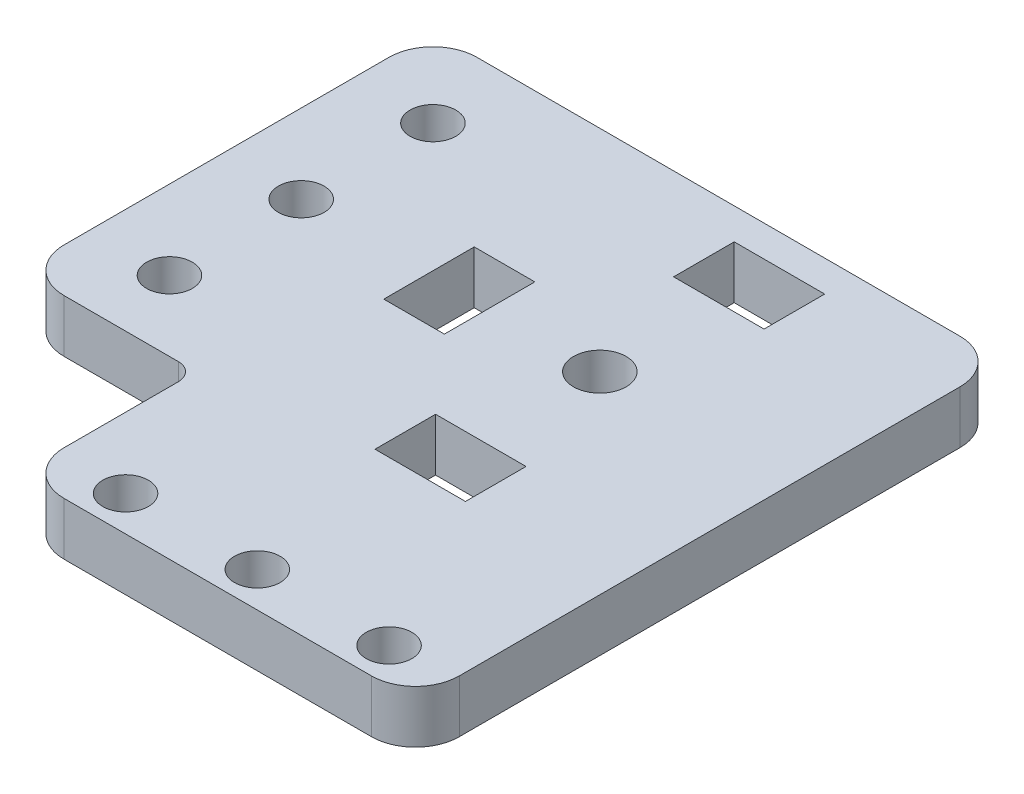
ISO-10303-21;
HEADER;
FILE_DESCRIPTION(('STEP AP214'),'2;1');
FILE_NAME('part.step','',(''),(''),'','','');
FILE_SCHEMA(('AUTOMOTIVE_DESIGN { 1 0 10303 214 1 1 1 1 }'));
ENDSEC;
DATA;
#1=APPLICATION_CONTEXT('core data for automotive mechanical design processes');
#2=APPLICATION_PROTOCOL_DEFINITION('international standard','automotive_design',2000,#1);
#3=PRODUCT_CONTEXT('',#1,'mechanical');
#4=PRODUCT('Part','Part','',(#3));
#5=PRODUCT_RELATED_PRODUCT_CATEGORY('part','',(#4));
#6=PRODUCT_DEFINITION_FORMATION('','',#4);
#7=PRODUCT_DEFINITION_CONTEXT('part definition',#1,'design');
#8=PRODUCT_DEFINITION('design','',#6,#7);
#9=PRODUCT_DEFINITION_SHAPE('','',#8);
#10=(LENGTH_UNIT() NAMED_UNIT(*) SI_UNIT(.MILLI.,.METRE.));
#11=(NAMED_UNIT(*) PLANE_ANGLE_UNIT() SI_UNIT($,.RADIAN.));
#12=(NAMED_UNIT(*) SI_UNIT($,.STERADIAN.) SOLID_ANGLE_UNIT());
#13=UNCERTAINTY_MEASURE_WITH_UNIT(LENGTH_MEASURE(1.E-05),#10,'distance_accuracy_value','');
#14=(GEOMETRIC_REPRESENTATION_CONTEXT(3) GLOBAL_UNCERTAINTY_ASSIGNED_CONTEXT((#13)) GLOBAL_UNIT_ASSIGNED_CONTEXT((#10,
#11,#12)) REPRESENTATION_CONTEXT('',''));
#15=CARTESIAN_POINT('',(0.,0.,0.));
#16=DIRECTION('',(0.,0.,1.));
#17=DIRECTION('',(1.,0.,0.));
#18=AXIS2_PLACEMENT_3D('',#15,#16,#17);
#19=CARTESIAN_POINT('',(20.,-6.,-5.));
#20=DIRECTION('',(-1.,0.,0.));
#21=DIRECTION('',(0.,0.,1.));
#22=AXIS2_PLACEMENT_3D('',#19,#20,#21);
#23=PLANE('',#22);
#24=DIRECTION('',(0.,0.,1.));
#25=VECTOR('',#24,1.);
#26=CARTESIAN_POINT('',(20.,0.,-5.));
#27=LINE('',#26,#25);
#28=CARTESIAN_POINT('',(20.,0.,-23.));
#29=VERTEX_POINT('',#28);
#30=CARTESIAN_POINT('',(20.,0.,-10.));
#31=VERTEX_POINT('',#30);
#32=EDGE_CURVE('E341',#29,#31,#27,.T.);
#33=ORIENTED_EDGE('',*,*,#32,.F.);
#34=DIRECTION('',(0.,1.,0.));
#35=VECTOR('',#34,1.);
#36=CARTESIAN_POINT('',(20.,-6.,-23.));
#37=LINE('',#36,#35);
#38=CARTESIAN_POINT('',(20.,-6.,-23.));
#39=VERTEX_POINT('',#38);
#40=EDGE_CURVE('E426',#29,#39,#37,.F.);
#41=ORIENTED_EDGE('',*,*,#40,.T.);
#42=DIRECTION('',(0.,0.,1.));
#43=VECTOR('',#42,1.);
#44=CARTESIAN_POINT('',(20.,-6.,-5.));
#45=LINE('',#44,#43);
#46=CARTESIAN_POINT('',(20.,-6.,-10.));
#47=VERTEX_POINT('',#46);
#48=EDGE_CURVE('E344',#39,#47,#45,.T.);
#49=ORIENTED_EDGE('',*,*,#48,.T.);
#50=DIRECTION('',(0.,1.,0.));
#51=VECTOR('',#50,1.);
#52=CARTESIAN_POINT('',(20.,-6.,-10.));
#53=LINE('',#52,#51);
#54=EDGE_CURVE('E410',#47,#31,#53,.T.);
#55=ORIENTED_EDGE('',*,*,#54,.T.);
#56=EDGE_LOOP('',(#33,#41,#49,#55));
#57=FACE_BOUND('',#56,.T.);
#58=ADVANCED_FACE('F39',(#57),#23,.T.);
#59=CARTESIAN_POINT('',(20.,-6.,-25.));
#60=DIRECTION('',(0.,0.,1.));
#61=DIRECTION('',(1.,0.,0.));
#62=AXIS2_PLACEMENT_3D('',#59,#60,#61);
#63=PLANE('',#62);
#64=DIRECTION('',(1.,0.,0.));
#65=VECTOR('',#64,1.);
#66=CARTESIAN_POINT('',(20.,-6.,-25.));
#67=LINE('',#66,#65);
#68=CARTESIAN_POINT('',(5.,-6.,-25.));
#69=VERTEX_POINT('',#68);
#70=CARTESIAN_POINT('',(18.,-6.,-25.));
#71=VERTEX_POINT('',#70);
#72=EDGE_CURVE('E359',#69,#71,#67,.T.);
#73=ORIENTED_EDGE('',*,*,#72,.T.);
#74=DIRECTION('',(0.,1.,0.));
#75=VECTOR('',#74,1.);
#76=CARTESIAN_POINT('',(18.,0.,-25.));
#77=LINE('',#76,#75);
#78=CARTESIAN_POINT('',(18.,0.,-25.));
#79=VERTEX_POINT('',#78);
#80=EDGE_CURVE('E423',#71,#79,#77,.T.);
#81=ORIENTED_EDGE('',*,*,#80,.T.);
#82=DIRECTION('',(1.,0.,0.));
#83=VECTOR('',#82,1.);
#84=CARTESIAN_POINT('',(20.,0.,-25.));
#85=LINE('',#84,#83);
#86=CARTESIAN_POINT('',(5.,0.,-25.));
#87=VERTEX_POINT('',#86);
#88=EDGE_CURVE('E347',#87,#79,#85,.T.);
#89=ORIENTED_EDGE('',*,*,#88,.F.);
#90=DIRECTION('',(0.,1.,0.));
#91=VECTOR('',#90,1.);
#92=CARTESIAN_POINT('',(5.,-6.,-25.));
#93=LINE('',#92,#91);
#94=EDGE_CURVE('E408',#87,#69,#93,.F.);
#95=ORIENTED_EDGE('',*,*,#94,.T.);
#96=EDGE_LOOP('',(#73,#81,#89,#95));
#97=FACE_BOUND('',#96,.T.);
#98=ADVANCED_FACE('F444',(#97),#63,.T.);
#99=CARTESIAN_POINT('',(0.,-6.,-25.));
#100=DIRECTION('',(-1.,0.,0.));
#101=DIRECTION('',(0.,0.,1.));
#102=AXIS2_PLACEMENT_3D('',#99,#100,#101);
#103=PLANE('',#102);
#104=DIRECTION('',(0.,0.,1.));
#105=VECTOR('',#104,1.);
#106=CARTESIAN_POINT('',(0.,0.,-25.));
#107=LINE('',#106,#105);
#108=CARTESIAN_POINT('',(0.,0.,-67.));
#109=VERTEX_POINT('',#108);
#110=CARTESIAN_POINT('',(0.,0.,-30.));
#111=VERTEX_POINT('',#110);
#112=EDGE_CURVE('E373',#109,#111,#107,.T.);
#113=ORIENTED_EDGE('',*,*,#112,.F.);
#114=DIRECTION('',(0.,1.,0.));
#115=VECTOR('',#114,1.);
#116=CARTESIAN_POINT('',(0.,-6.,-67.));
#117=LINE('',#116,#115);
#118=CARTESIAN_POINT('',(0.,-6.,-67.));
#119=VERTEX_POINT('',#118);
#120=EDGE_CURVE('E395',#109,#119,#117,.F.);
#121=ORIENTED_EDGE('',*,*,#120,.T.);
#122=DIRECTION('',(0.,0.,1.));
#123=VECTOR('',#122,1.);
#124=CARTESIAN_POINT('',(0.,-6.,-25.));
#125=LINE('',#124,#123);
#126=CARTESIAN_POINT('',(0.,-6.,-30.));
#127=VERTEX_POINT('',#126);
#128=EDGE_CURVE('E356',#119,#127,#125,.T.);
#129=ORIENTED_EDGE('',*,*,#128,.T.);
#130=DIRECTION('',(0.,1.,0.));
#131=VECTOR('',#130,1.);
#132=CARTESIAN_POINT('',(0.,-6.,-30.));
#133=LINE('',#132,#131);
#134=EDGE_CURVE('E392',#127,#111,#133,.T.);
#135=ORIENTED_EDGE('',*,*,#134,.T.);
#136=EDGE_LOOP('',(#113,#121,#129,#135));
#137=FACE_BOUND('',#136,.T.);
#138=ADVANCED_FACE('F452',(#137),#103,.T.);
#139=CARTESIAN_POINT('',(0.,-6.,-72.));
#140=DIRECTION('',(0.,0.,-1.));
#141=DIRECTION('',(-1.,0.,0.));
#142=AXIS2_PLACEMENT_3D('',#139,#140,#141);
#143=PLANE('',#142);
#144=DIRECTION('',(-1.,0.,0.));
#145=VECTOR('',#144,1.);
#146=CARTESIAN_POINT('',(0.,-6.,-72.));
#147=LINE('',#146,#145);
#148=CARTESIAN_POINT('',(60.,-6.,-72.));
#149=VERTEX_POINT('',#148);
#150=CARTESIAN_POINT('',(5.,-6.,-72.));
#151=VERTEX_POINT('',#150);
#152=EDGE_CURVE('E353',#149,#151,#147,.T.);
#153=ORIENTED_EDGE('',*,*,#152,.T.);
#154=DIRECTION('',(0.,1.,0.));
#155=VECTOR('',#154,1.);
#156=CARTESIAN_POINT('',(5.,-6.,-72.));
#157=LINE('',#156,#155);
#158=CARTESIAN_POINT('',(5.,0.,-72.));
#159=VERTEX_POINT('',#158);
#160=EDGE_CURVE('E379',#151,#159,#157,.T.);
#161=ORIENTED_EDGE('',*,*,#160,.T.);
#162=DIRECTION('',(-1.,0.,0.));
#163=VECTOR('',#162,1.);
#164=CARTESIAN_POINT('',(0.,0.,-72.));
#165=LINE('',#164,#163);
#166=CARTESIAN_POINT('',(60.,0.,-72.));
#167=VERTEX_POINT('',#166);
#168=EDGE_CURVE('E370',#167,#159,#165,.T.);
#169=ORIENTED_EDGE('',*,*,#168,.F.);
#170=DIRECTION('',(0.,1.,0.));
#171=VECTOR('',#170,1.);
#172=CARTESIAN_POINT('',(60.,-6.,-72.));
#173=LINE('',#172,#171);
#174=EDGE_CURVE('E362',#167,#149,#173,.F.);
#175=ORIENTED_EDGE('',*,*,#174,.T.);
#176=EDGE_LOOP('',(#153,#161,#169,#175));
#177=FACE_BOUND('',#176,.T.);
#178=ADVANCED_FACE('F460',(#177),#143,.T.);
#179=CARTESIAN_POINT('',(65.,-6.,-72.));
#180=DIRECTION('',(1.,0.,0.));
#181=DIRECTION('',(0.,0.,-1.));
#182=AXIS2_PLACEMENT_3D('',#179,#180,#181);
#183=PLANE('',#182);
#184=DIRECTION('',(0.,0.,-1.));
#185=VECTOR('',#184,1.);
#186=CARTESIAN_POINT('',(65.,-6.,-72.));
#187=LINE('',#186,#185);
#188=CARTESIAN_POINT('',(65.,-6.,-10.));
#189=VERTEX_POINT('',#188);
#190=CARTESIAN_POINT('',(65.,-6.,-67.));
#191=VERTEX_POINT('',#190);
#192=EDGE_CURVE('E350',#189,#191,#187,.T.);
#193=ORIENTED_EDGE('',*,*,#192,.T.);
#194=DIRECTION('',(0.,1.,0.));
#195=VECTOR('',#194,1.);
#196=CARTESIAN_POINT('',(65.,-6.,-67.));
#197=LINE('',#196,#195);
#198=CARTESIAN_POINT('',(65.,0.,-67.));
#199=VERTEX_POINT('',#198);
#200=EDGE_CURVE('E420',#191,#199,#197,.T.);
#201=ORIENTED_EDGE('',*,*,#200,.T.);
#202=DIRECTION('',(0.,0.,-1.));
#203=VECTOR('',#202,1.);
#204=CARTESIAN_POINT('',(65.,0.,-72.));
#205=LINE('',#204,#203);
#206=CARTESIAN_POINT('',(65.,0.,-10.));
#207=VERTEX_POINT('',#206);
#208=EDGE_CURVE('E367',#207,#199,#205,.T.);
#209=ORIENTED_EDGE('',*,*,#208,.F.);
#210=DIRECTION('',(0.,1.,0.));
#211=VECTOR('',#210,1.);
#212=CARTESIAN_POINT('',(65.,-6.,-10.));
#213=LINE('',#212,#211);
#214=EDGE_CURVE('E418',#207,#189,#213,.F.);
#215=ORIENTED_EDGE('',*,*,#214,.T.);
#216=EDGE_LOOP('',(#193,#201,#209,#215));
#217=FACE_BOUND('',#216,.T.);
#218=ADVANCED_FACE('F469',(#217),#183,.T.);
#219=CARTESIAN_POINT('',(65.,-6.,-5.00000000000001));
#220=DIRECTION('',(0.,0.,1.));
#221=DIRECTION('',(1.,0.,0.));
#222=AXIS2_PLACEMENT_3D('',#219,#220,#221);
#223=PLANE('',#222);
#224=DIRECTION('',(1.,0.,0.));
#225=VECTOR('',#224,1.);
#226=CARTESIAN_POINT('',(65.,0.,-5.00000000000001));
#227=LINE('',#226,#225);
#228=CARTESIAN_POINT('',(25.,0.,-5.));
#229=VERTEX_POINT('',#228);
#230=CARTESIAN_POINT('',(60.,0.,-5.00000000000001));
#231=VERTEX_POINT('',#230);
#232=EDGE_CURVE('E364',#229,#231,#227,.T.);
#233=ORIENTED_EDGE('',*,*,#232,.F.);
#234=DIRECTION('',(0.,1.,0.));
#235=VECTOR('',#234,1.);
#236=CARTESIAN_POINT('',(25.,-6.,-5.));
#237=LINE('',#236,#235);
#238=CARTESIAN_POINT('',(25.,-6.,-5.));
#239=VERTEX_POINT('',#238);
#240=EDGE_CURVE('E416',#229,#239,#237,.F.);
#241=ORIENTED_EDGE('',*,*,#240,.T.);
#242=DIRECTION('',(1.,0.,0.));
#243=VECTOR('',#242,1.);
#244=CARTESIAN_POINT('',(65.,-6.,-5.00000000000001));
#245=LINE('',#244,#243);
#246=CARTESIAN_POINT('',(60.,-6.,-5.00000000000001));
#247=VERTEX_POINT('',#246);
#248=EDGE_CURVE('E346',#239,#247,#245,.T.);
#249=ORIENTED_EDGE('',*,*,#248,.T.);
#250=DIRECTION('',(0.,1.,0.));
#251=VECTOR('',#250,1.);
#252=CARTESIAN_POINT('',(60.,-6.,-5.00000000000001));
#253=LINE('',#252,#251);
#254=EDGE_CURVE('E413',#247,#231,#253,.T.);
#255=ORIENTED_EDGE('',*,*,#254,.T.);
#256=EDGE_LOOP('',(#233,#241,#249,#255));
#257=FACE_BOUND('',#256,.T.);
#258=ADVANCED_FACE('F479',(#257),#223,.T.);
#259=CARTESIAN_POINT('',(0.,-6.,0.));
#260=DIRECTION('',(0.,1.,0.));
#261=DIRECTION('',(0.,0.,1.));
#262=AXIS2_PLACEMENT_3D('',#259,#260,#261);
#263=PLANE('',#262);
#264=DIRECTION('',(1.,0.,0.));
#265=VECTOR('',#264,1.);
#266=CARTESIAN_POINT('',(0.,-6.,-42.8500000000001));
#267=LINE('',#266,#265);
#268=CARTESIAN_POINT('',(23.55,-6.,-42.8500000000001));
#269=VERTEX_POINT('',#268);
#270=CARTESIAN_POINT('',(30.45,-6.,-42.85));
#271=VERTEX_POINT('',#270);
#272=EDGE_CURVE('E301',#269,#271,#267,.T.);
#273=ORIENTED_EDGE('',*,*,#272,.T.);
#274=DIRECTION('',(0.,0.,-1.));
#275=VECTOR('',#274,1.);
#276=CARTESIAN_POINT('',(30.45,-6.,0.));
#277=LINE('',#276,#275);
#278=CARTESIAN_POINT('',(30.45,-6.,-53.15));
#279=VERTEX_POINT('',#278);
#280=EDGE_CURVE('E304',#271,#279,#277,.T.);
#281=ORIENTED_EDGE('',*,*,#280,.T.);
#282=DIRECTION('',(-1.,0.,0.));
#283=VECTOR('',#282,1.);
#284=CARTESIAN_POINT('',(0.,-6.,-53.15));
#285=LINE('',#284,#283);
#286=CARTESIAN_POINT('',(23.55,-6.,-53.15));
#287=VERTEX_POINT('',#286);
#288=EDGE_CURVE('E298',#279,#287,#285,.T.);
#289=ORIENTED_EDGE('',*,*,#288,.T.);
#290=DIRECTION('',(0.,0.,1.));
#291=VECTOR('',#290,1.);
#292=CARTESIAN_POINT('',(23.55,-6.,0.));
#293=LINE('',#292,#291);
#294=EDGE_CURVE('E204',#287,#269,#293,.T.);
#295=ORIENTED_EDGE('',*,*,#294,.T.);
#296=EDGE_LOOP('',(#273,#281,#289,#295));
#297=FACE_BOUND('',#296,.T.);
#298=CARTESIAN_POINT('',(43.,-6.,-48.));
#299=DIRECTION('',(0.,1.,0.));
#300=DIRECTION('',(0.,0.,1.));
#301=AXIS2_PLACEMENT_3D('',#298,#299,#300);
#302=CIRCLE('',#301,3.00000000000001);
#303=CARTESIAN_POINT('',(43.,-6.,-45.));
#304=VERTEX_POINT('',#303);
#305=EDGE_CURVE('E295',#304,#304,#302,.T.);
#306=ORIENTED_EDGE('',*,*,#305,.T.);
#307=EDGE_LOOP('',(#306));
#308=FACE_BOUND('',#307,.T.);
#309=DIRECTION('',(1.,0.,0.));
#310=VECTOR('',#309,1.);
#311=CARTESIAN_POINT('',(0.,-6.,-61.5500000000001));
#312=LINE('',#311,#310);
#313=CARTESIAN_POINT('',(37.85,-6.,-61.5500000000001));
#314=VERTEX_POINT('',#313);
#315=CARTESIAN_POINT('',(48.15,-6.,-61.55));
#316=VERTEX_POINT('',#315);
#317=EDGE_CURVE('E289',#314,#316,#312,.T.);
#318=ORIENTED_EDGE('',*,*,#317,.T.);
#319=DIRECTION('',(0.,0.,-1.));
#320=VECTOR('',#319,1.);
#321=CARTESIAN_POINT('',(48.15,-6.,0.));
#322=LINE('',#321,#320);
#323=CARTESIAN_POINT('',(48.15,-6.,-68.45));
#324=VERTEX_POINT('',#323);
#325=EDGE_CURVE('E292',#316,#324,#322,.T.);
#326=ORIENTED_EDGE('',*,*,#325,.T.);
#327=DIRECTION('',(-1.,0.,0.));
#328=VECTOR('',#327,1.);
#329=CARTESIAN_POINT('',(0.,-6.,-68.45));
#330=LINE('',#329,#328);
#331=CARTESIAN_POINT('',(37.85,-6.,-68.45));
#332=VERTEX_POINT('',#331);
#333=EDGE_CURVE('E283',#324,#332,#330,.T.);
#334=ORIENTED_EDGE('',*,*,#333,.T.);
#335=DIRECTION('',(0.,0.,1.));
#336=VECTOR('',#335,1.);
#337=CARTESIAN_POINT('',(37.8499999999999,-6.,0.));
#338=LINE('',#337,#336);
#339=EDGE_CURVE('E286',#332,#314,#338,.T.);
#340=ORIENTED_EDGE('',*,*,#339,.T.);
#341=EDGE_LOOP('',(#318,#326,#334,#340));
#342=FACE_BOUND('',#341,.T.);
#343=DIRECTION('',(1.,0.,0.));
#344=VECTOR('',#343,1.);
#345=CARTESIAN_POINT('',(0.,-6.,-27.55));
#346=LINE('',#345,#344);
#347=CARTESIAN_POINT('',(37.85,-6.,-27.55));
#348=VERTEX_POINT('',#347);
#349=CARTESIAN_POINT('',(48.1499999999999,-6.,-27.55));
#350=VERTEX_POINT('',#349);
#351=EDGE_CURVE('E277',#348,#350,#346,.T.);
#352=ORIENTED_EDGE('',*,*,#351,.T.);
#353=DIRECTION('',(0.,0.,-1.));
#354=VECTOR('',#353,1.);
#355=CARTESIAN_POINT('',(48.1499999999999,-6.,0.));
#356=LINE('',#355,#354);
#357=CARTESIAN_POINT('',(48.15,-6.,-34.45));
#358=VERTEX_POINT('',#357);
#359=EDGE_CURVE('E280',#350,#358,#356,.T.);
#360=ORIENTED_EDGE('',*,*,#359,.T.);
#361=DIRECTION('',(-1.,0.,0.));
#362=VECTOR('',#361,1.);
#363=CARTESIAN_POINT('',(0.,-6.,-34.45));
#364=LINE('',#363,#362);
#365=CARTESIAN_POINT('',(37.85,-6.,-34.45));
#366=VERTEX_POINT('',#365);
#367=EDGE_CURVE('E228',#358,#366,#364,.T.);
#368=ORIENTED_EDGE('',*,*,#367,.T.);
#369=DIRECTION('',(0.,0.,1.));
#370=VECTOR('',#369,1.);
#371=CARTESIAN_POINT('',(37.85,-6.,0.));
#372=LINE('',#371,#370);
#373=EDGE_CURVE('E274',#366,#348,#372,.T.);
#374=ORIENTED_EDGE('',*,*,#373,.T.);
#375=EDGE_LOOP('',(#352,#360,#368,#374));
#376=FACE_BOUND('',#375,.T.);
#377=CARTESIAN_POINT('',(8.99999999999984,-6.,-63.));
#378=DIRECTION('',(0.,1.,0.));
#379=DIRECTION('',(0.,0.,1.));
#380=AXIS2_PLACEMENT_3D('',#377,#378,#379);
#381=CIRCLE('',#380,2.60000000000001);
#382=CARTESIAN_POINT('',(8.99999999999984,-6.,-60.4));
#383=VERTEX_POINT('',#382);
#384=EDGE_CURVE('E308',#383,#383,#381,.T.);
#385=ORIENTED_EDGE('',*,*,#384,.T.);
#386=EDGE_LOOP('',(#385));
#387=FACE_BOUND('',#386,.T.);
#388=CARTESIAN_POINT('',(8.9999999999999,-6.,-48.));
#389=DIRECTION('',(0.,1.,0.));
#390=DIRECTION('',(0.,0.,1.));
#391=AXIS2_PLACEMENT_3D('',#388,#389,#390);
#392=CIRCLE('',#391,2.6);
#393=CARTESIAN_POINT('',(8.9999999999999,-6.,-45.4));
#394=VERTEX_POINT('',#393);
#395=EDGE_CURVE('E314',#394,#394,#392,.T.);
#396=ORIENTED_EDGE('',*,*,#395,.T.);
#397=EDGE_LOOP('',(#396));
#398=FACE_BOUND('',#397,.T.);
#399=CARTESIAN_POINT('',(9.,-6.,-33.));
#400=DIRECTION('',(0.,1.,0.));
#401=DIRECTION('',(0.,0.,1.));
#402=AXIS2_PLACEMENT_3D('',#399,#400,#401);
#403=CIRCLE('',#402,2.6);
#404=CARTESIAN_POINT('',(9.,-6.,-30.4));
#405=VERTEX_POINT('',#404);
#406=EDGE_CURVE('E320',#405,#405,#403,.T.);
#407=ORIENTED_EDGE('',*,*,#406,.T.);
#408=EDGE_LOOP('',(#407));
#409=FACE_BOUND('',#408,.T.);
#410=CARTESIAN_POINT('',(58.,-6.,-8.99999999999999));
#411=DIRECTION('',(0.,1.,0.));
#412=DIRECTION('',(0.,0.,1.));
#413=AXIS2_PLACEMENT_3D('',#410,#411,#412);
#414=CIRCLE('',#413,2.59999999999997);
#415=CARTESIAN_POINT('',(58.,-6.,-6.40000000000003));
#416=VERTEX_POINT('',#415);
#417=EDGE_CURVE('E326',#416,#416,#414,.T.);
#418=ORIENTED_EDGE('',*,*,#417,.T.);
#419=EDGE_LOOP('',(#418));
#420=FACE_BOUND('',#419,.T.);
#421=CARTESIAN_POINT('',(43.,-6.,-8.99999999999999));
#422=DIRECTION('',(0.,1.,0.));
#423=DIRECTION('',(0.,0.,1.));
#424=AXIS2_PLACEMENT_3D('',#421,#422,#423);
#425=CIRCLE('',#424,2.6);
#426=CARTESIAN_POINT('',(43.,-6.,-6.39999999999999));
#427=VERTEX_POINT('',#426);
#428=EDGE_CURVE('E332',#427,#427,#425,.T.);
#429=ORIENTED_EDGE('',*,*,#428,.T.);
#430=EDGE_LOOP('',(#429));
#431=FACE_BOUND('',#430,.T.);
#432=CARTESIAN_POINT('',(28.,-6.,-8.99999999999999));
#433=DIRECTION('',(0.,1.,0.));
#434=DIRECTION('',(0.,0.,1.));
#435=AXIS2_PLACEMENT_3D('',#432,#433,#434);
#436=CIRCLE('',#435,2.6);
#437=CARTESIAN_POINT('',(28.,-6.,-6.39999999999999));
#438=VERTEX_POINT('',#437);
#439=EDGE_CURVE('E338',#438,#438,#436,.T.);
#440=ORIENTED_EDGE('',*,*,#439,.T.);
#441=EDGE_LOOP('',(#440));
#442=FACE_BOUND('',#441,.T.);
#443=ORIENTED_EDGE('',*,*,#128,.F.);
#444=CARTESIAN_POINT('',(5.,-6.,-67.));
#445=DIRECTION('',(0.,1.,0.));
#446=DIRECTION('',(0.,0.,1.));
#447=AXIS2_PLACEMENT_3D('',#444,#445,#446);
#448=CIRCLE('',#447,5.);
#449=EDGE_CURVE('E406',#119,#151,#448,.F.);
#450=ORIENTED_EDGE('',*,*,#449,.T.);
#451=ORIENTED_EDGE('',*,*,#152,.F.);
#452=CARTESIAN_POINT('',(60.,-6.,-67.));
#453=DIRECTION('',(0.,1.,0.));
#454=DIRECTION('',(0.,0.,1.));
#455=AXIS2_PLACEMENT_3D('',#452,#453,#454);
#456=CIRCLE('',#455,5.);
#457=EDGE_CURVE('E399',#149,#191,#456,.F.);
#458=ORIENTED_EDGE('',*,*,#457,.T.);
#459=ORIENTED_EDGE('',*,*,#192,.F.);
#460=CARTESIAN_POINT('',(60.,-6.,-10.));
#461=DIRECTION('',(0.,1.,0.));
#462=DIRECTION('',(0.,0.,1.));
#463=AXIS2_PLACEMENT_3D('',#460,#461,#462);
#464=CIRCLE('',#463,5.);
#465=EDGE_CURVE('E397',#189,#247,#464,.F.);
#466=ORIENTED_EDGE('',*,*,#465,.T.);
#467=ORIENTED_EDGE('',*,*,#248,.F.);
#468=CARTESIAN_POINT('',(25.,-6.,-10.));
#469=DIRECTION('',(0.,1.,0.));
#470=DIRECTION('',(0.,0.,1.));
#471=AXIS2_PLACEMENT_3D('',#468,#469,#470);
#472=CIRCLE('',#471,5.);
#473=EDGE_CURVE('E401',#239,#47,#472,.F.);
#474=ORIENTED_EDGE('',*,*,#473,.T.);
#475=ORIENTED_EDGE('',*,*,#48,.F.);
#476=CARTESIAN_POINT('',(18.,-6.,-23.));
#477=DIRECTION('',(0.,1.,0.));
#478=DIRECTION('',(0.,0.,1.));
#479=AXIS2_PLACEMENT_3D('',#476,#477,#478);
#480=CIRCLE('',#479,2.);
#481=EDGE_CURVE('E11',#39,#71,#480,.T.);
#482=ORIENTED_EDGE('',*,*,#481,.T.);
#483=ORIENTED_EDGE('',*,*,#72,.F.);
#484=CARTESIAN_POINT('',(5.,-6.,-30.));
#485=DIRECTION('',(0.,1.,0.));
#486=DIRECTION('',(0.,0.,1.));
#487=AXIS2_PLACEMENT_3D('',#484,#485,#486);
#488=CIRCLE('',#487,5.);
#489=EDGE_CURVE('E404',#69,#127,#488,.F.);
#490=ORIENTED_EDGE('',*,*,#489,.T.);
#491=EDGE_LOOP('',(#443,#450,#451,#458,#459,#466,#467,#474,#475,#482,#483,#490));
#492=FACE_BOUND('',#491,.T.);
#493=ADVANCED_FACE('F441',(#297,#308,#342,#376,#387,#398,#409,#420,#431,#442,#492),#263,.F.);
#494=CARTESIAN_POINT('',(0.,0.,0.));
#495=DIRECTION('',(0.,1.,0.));
#496=DIRECTION('',(0.,0.,1.));
#497=AXIS2_PLACEMENT_3D('',#494,#495,#496);
#498=PLANE('',#497);
#499=DIRECTION('',(0.,0.,-1.));
#500=VECTOR('',#499,1.);
#501=CARTESIAN_POINT('',(30.45,0.,-42.85));
#502=LINE('',#501,#500);
#503=CARTESIAN_POINT('',(30.45,0.,-42.85));
#504=VERTEX_POINT('',#503);
#505=CARTESIAN_POINT('',(30.45,0.,-53.15));
#506=VERTEX_POINT('',#505);
#507=EDGE_CURVE('E216',#504,#506,#502,.T.);
#508=ORIENTED_EDGE('',*,*,#507,.F.);
#509=DIRECTION('',(1.,0.,0.));
#510=VECTOR('',#509,1.);
#511=CARTESIAN_POINT('',(23.55,0.,-42.8500000000001));
#512=LINE('',#511,#510);
#513=CARTESIAN_POINT('',(23.55,0.,-42.8500000000001));
#514=VERTEX_POINT('',#513);
#515=EDGE_CURVE('E221',#514,#504,#512,.T.);
#516=ORIENTED_EDGE('',*,*,#515,.F.);
#517=DIRECTION('',(0.,0.,1.));
#518=VECTOR('',#517,1.);
#519=CARTESIAN_POINT('',(23.55,0.,-53.15));
#520=LINE('',#519,#518);
#521=CARTESIAN_POINT('',(23.55,0.,-53.15));
#522=VERTEX_POINT('',#521);
#523=EDGE_CURVE('E201',#522,#514,#520,.T.);
#524=ORIENTED_EDGE('',*,*,#523,.F.);
#525=DIRECTION('',(-1.,0.,0.));
#526=VECTOR('',#525,1.);
#527=CARTESIAN_POINT('',(30.45,0.,-53.15));
#528=LINE('',#527,#526);
#529=EDGE_CURVE('E211',#506,#522,#528,.T.);
#530=ORIENTED_EDGE('',*,*,#529,.F.);
#531=EDGE_LOOP('',(#508,#516,#524,#530));
#532=FACE_BOUND('',#531,.T.);
#533=CARTESIAN_POINT('',(43.,0.,-48.));
#534=DIRECTION('',(0.,1.,0.));
#535=DIRECTION('',(0.,0.,1.));
#536=AXIS2_PLACEMENT_3D('',#533,#534,#535);
#537=CIRCLE('',#536,3.00000000000001);
#538=CARTESIAN_POINT('',(43.,0.,-45.));
#539=VERTEX_POINT('',#538);
#540=EDGE_CURVE('E231',#539,#539,#537,.T.);
#541=ORIENTED_EDGE('',*,*,#540,.F.);
#542=EDGE_LOOP('',(#541));
#543=FACE_BOUND('',#542,.T.);
#544=DIRECTION('',(0.,0.,-1.));
#545=VECTOR('',#544,1.);
#546=CARTESIAN_POINT('',(48.15,0.,-61.55));
#547=LINE('',#546,#545);
#548=CARTESIAN_POINT('',(48.15,0.,-61.55));
#549=VERTEX_POINT('',#548);
#550=CARTESIAN_POINT('',(48.15,0.,-68.45));
#551=VERTEX_POINT('',#550);
#552=EDGE_CURVE('E234',#549,#551,#547,.T.);
#553=ORIENTED_EDGE('',*,*,#552,.F.);
#554=DIRECTION('',(1.,0.,0.));
#555=VECTOR('',#554,1.);
#556=CARTESIAN_POINT('',(37.85,0.,-61.5500000000001));
#557=LINE('',#556,#555);
#558=CARTESIAN_POINT('',(37.85,0.,-61.5500000000001));
#559=VERTEX_POINT('',#558);
#560=EDGE_CURVE('E262',#559,#549,#557,.T.);
#561=ORIENTED_EDGE('',*,*,#560,.F.);
#562=DIRECTION('',(0.,0.,1.));
#563=VECTOR('',#562,1.);
#564=CARTESIAN_POINT('',(37.85,0.,-68.45));
#565=LINE('',#564,#563);
#566=CARTESIAN_POINT('',(37.85,0.,-68.45));
#567=VERTEX_POINT('',#566);
#568=EDGE_CURVE('E259',#567,#559,#565,.T.);
#569=ORIENTED_EDGE('',*,*,#568,.F.);
#570=DIRECTION('',(-1.,0.,0.));
#571=VECTOR('',#570,1.);
#572=CARTESIAN_POINT('',(48.15,0.,-68.45));
#573=LINE('',#572,#571);
#574=EDGE_CURVE('E257',#551,#567,#573,.T.);
#575=ORIENTED_EDGE('',*,*,#574,.F.);
#576=EDGE_LOOP('',(#553,#561,#569,#575));
#577=FACE_BOUND('',#576,.T.);
#578=DIRECTION('',(0.,0.,-1.));
#579=VECTOR('',#578,1.);
#580=CARTESIAN_POINT('',(48.1499999999999,0.,-27.55));
#581=LINE('',#580,#579);
#582=CARTESIAN_POINT('',(48.1499999999999,0.,-27.55));
#583=VERTEX_POINT('',#582);
#584=CARTESIAN_POINT('',(48.15,0.,-34.45));
#585=VERTEX_POINT('',#584);
#586=EDGE_CURVE('E235',#583,#585,#581,.T.);
#587=ORIENTED_EDGE('',*,*,#586,.F.);
#588=DIRECTION('',(1.,0.,0.));
#589=VECTOR('',#588,1.);
#590=CARTESIAN_POINT('',(37.85,0.,-27.55));
#591=LINE('',#590,#589);
#592=CARTESIAN_POINT('',(37.85,0.,-27.55));
#593=VERTEX_POINT('',#592);
#594=EDGE_CURVE('E244',#593,#583,#591,.T.);
#595=ORIENTED_EDGE('',*,*,#594,.F.);
#596=DIRECTION('',(0.,0.,1.));
#597=VECTOR('',#596,1.);
#598=CARTESIAN_POINT('',(37.85,0.,-34.45));
#599=LINE('',#598,#597);
#600=CARTESIAN_POINT('',(37.85,0.,-34.45));
#601=VERTEX_POINT('',#600);
#602=EDGE_CURVE('E241',#601,#593,#599,.T.);
#603=ORIENTED_EDGE('',*,*,#602,.F.);
#604=DIRECTION('',(-1.,0.,0.));
#605=VECTOR('',#604,1.);
#606=CARTESIAN_POINT('',(48.15,0.,-34.45));
#607=LINE('',#606,#605);
#608=EDGE_CURVE('E237',#585,#601,#607,.T.);
#609=ORIENTED_EDGE('',*,*,#608,.F.);
#610=EDGE_LOOP('',(#587,#595,#603,#609));
#611=FACE_BOUND('',#610,.T.);
#612=CARTESIAN_POINT('',(8.99999999999984,0.,-63.));
#613=DIRECTION('',(0.,1.,0.));
#614=DIRECTION('',(0.,0.,1.));
#615=AXIS2_PLACEMENT_3D('',#612,#613,#614);
#616=CIRCLE('',#615,2.60000000000001);
#617=CARTESIAN_POINT('',(8.99999999999984,0.,-60.4));
#618=VERTEX_POINT('',#617);
#619=EDGE_CURVE('E307',#618,#618,#616,.T.);
#620=ORIENTED_EDGE('',*,*,#619,.F.);
#621=EDGE_LOOP('',(#620));
#622=FACE_BOUND('',#621,.T.);
#623=CARTESIAN_POINT('',(8.9999999999999,0.,-48.));
#624=DIRECTION('',(0.,1.,0.));
#625=DIRECTION('',(0.,0.,1.));
#626=AXIS2_PLACEMENT_3D('',#623,#624,#625);
#627=CIRCLE('',#626,2.6);
#628=CARTESIAN_POINT('',(8.9999999999999,0.,-45.4));
#629=VERTEX_POINT('',#628);
#630=EDGE_CURVE('E311',#629,#629,#627,.T.);
#631=ORIENTED_EDGE('',*,*,#630,.F.);
#632=EDGE_LOOP('',(#631));
#633=FACE_BOUND('',#632,.T.);
#634=CARTESIAN_POINT('',(9.,0.,-33.));
#635=DIRECTION('',(0.,1.,0.));
#636=DIRECTION('',(0.,0.,1.));
#637=AXIS2_PLACEMENT_3D('',#634,#635,#636);
#638=CIRCLE('',#637,2.6);
#639=CARTESIAN_POINT('',(9.,0.,-30.4));
#640=VERTEX_POINT('',#639);
#641=EDGE_CURVE('E317',#640,#640,#638,.T.);
#642=ORIENTED_EDGE('',*,*,#641,.F.);
#643=EDGE_LOOP('',(#642));
#644=FACE_BOUND('',#643,.T.);
#645=CARTESIAN_POINT('',(58.,0.,-8.99999999999999));
#646=DIRECTION('',(0.,1.,0.));
#647=DIRECTION('',(0.,0.,1.));
#648=AXIS2_PLACEMENT_3D('',#645,#646,#647);
#649=CIRCLE('',#648,2.59999999999997);
#650=CARTESIAN_POINT('',(58.,0.,-6.40000000000003));
#651=VERTEX_POINT('',#650);
#652=EDGE_CURVE('E323',#651,#651,#649,.T.);
#653=ORIENTED_EDGE('',*,*,#652,.F.);
#654=EDGE_LOOP('',(#653));
#655=FACE_BOUND('',#654,.T.);
#656=CARTESIAN_POINT('',(43.,0.,-8.99999999999999));
#657=DIRECTION('',(0.,1.,0.));
#658=DIRECTION('',(0.,0.,1.));
#659=AXIS2_PLACEMENT_3D('',#656,#657,#658);
#660=CIRCLE('',#659,2.6);
#661=CARTESIAN_POINT('',(43.,0.,-6.39999999999999));
#662=VERTEX_POINT('',#661);
#663=EDGE_CURVE('E329',#662,#662,#660,.T.);
#664=ORIENTED_EDGE('',*,*,#663,.F.);
#665=EDGE_LOOP('',(#664));
#666=FACE_BOUND('',#665,.T.);
#667=CARTESIAN_POINT('',(28.,0.,-8.99999999999999));
#668=DIRECTION('',(0.,1.,0.));
#669=DIRECTION('',(0.,0.,1.));
#670=AXIS2_PLACEMENT_3D('',#667,#668,#669);
#671=CIRCLE('',#670,2.6);
#672=CARTESIAN_POINT('',(28.,0.,-6.39999999999999));
#673=VERTEX_POINT('',#672);
#674=EDGE_CURVE('E335',#673,#673,#671,.T.);
#675=ORIENTED_EDGE('',*,*,#674,.F.);
#676=EDGE_LOOP('',(#675));
#677=FACE_BOUND('',#676,.T.);
#678=ORIENTED_EDGE('',*,*,#168,.T.);
#679=CARTESIAN_POINT('',(5.,0.,-67.));
#680=DIRECTION('',(0.,1.,0.));
#681=DIRECTION('',(0.,0.,1.));
#682=AXIS2_PLACEMENT_3D('',#679,#680,#681);
#683=CIRCLE('',#682,5.);
#684=EDGE_CURVE('E390',#159,#109,#683,.T.);
#685=ORIENTED_EDGE('',*,*,#684,.T.);
#686=ORIENTED_EDGE('',*,*,#112,.T.);
#687=CARTESIAN_POINT('',(5.,0.,-30.));
#688=DIRECTION('',(0.,1.,0.));
#689=DIRECTION('',(0.,0.,1.));
#690=AXIS2_PLACEMENT_3D('',#687,#688,#689);
#691=CIRCLE('',#690,5.);
#692=EDGE_CURVE('E388',#111,#87,#691,.T.);
#693=ORIENTED_EDGE('',*,*,#692,.T.);
#694=ORIENTED_EDGE('',*,*,#88,.T.);
#695=CARTESIAN_POINT('',(18.,0.,-23.));
#696=DIRECTION('',(0.,1.,0.));
#697=DIRECTION('',(0.,0.,1.));
#698=AXIS2_PLACEMENT_3D('',#695,#696,#697);
#699=CIRCLE('',#698,2.);
#700=EDGE_CURVE('E47',#79,#29,#699,.F.);
#701=ORIENTED_EDGE('',*,*,#700,.T.);
#702=ORIENTED_EDGE('',*,*,#32,.T.);
#703=CARTESIAN_POINT('',(25.,0.,-10.));
#704=DIRECTION('',(0.,1.,0.));
#705=DIRECTION('',(0.,0.,1.));
#706=AXIS2_PLACEMENT_3D('',#703,#704,#705);
#707=CIRCLE('',#706,5.);
#708=EDGE_CURVE('E386',#31,#229,#707,.T.);
#709=ORIENTED_EDGE('',*,*,#708,.T.);
#710=ORIENTED_EDGE('',*,*,#232,.T.);
#711=CARTESIAN_POINT('',(60.,0.,-10.));
#712=DIRECTION('',(0.,1.,0.));
#713=DIRECTION('',(0.,0.,1.));
#714=AXIS2_PLACEMENT_3D('',#711,#712,#713);
#715=CIRCLE('',#714,5.);
#716=EDGE_CURVE('E382',#231,#207,#715,.T.);
#717=ORIENTED_EDGE('',*,*,#716,.T.);
#718=ORIENTED_EDGE('',*,*,#208,.T.);
#719=CARTESIAN_POINT('',(60.,0.,-67.));
#720=DIRECTION('',(0.,1.,0.));
#721=DIRECTION('',(0.,0.,1.));
#722=AXIS2_PLACEMENT_3D('',#719,#720,#721);
#723=CIRCLE('',#722,5.);
#724=EDGE_CURVE('E384',#199,#167,#723,.T.);
#725=ORIENTED_EDGE('',*,*,#724,.T.);
#726=EDGE_LOOP('',(#678,#685,#686,#693,#694,#701,#702,#709,#710,#717,#718,#725));
#727=FACE_BOUND('',#726,.T.);
#728=ADVANCED_FACE('F218',(#532,#543,#577,#611,#622,#633,#644,#655,#666,#677,#727),#498,.T.);
#729=CARTESIAN_POINT('',(28.,-6.,-8.99999999999999));
#730=DIRECTION('',(0.,1.,0.));
#731=DIRECTION('',(0.,0.,1.));
#732=AXIS2_PLACEMENT_3D('',#729,#730,#731);
#733=CYLINDRICAL_SURFACE('',#732,2.6);
#734=ORIENTED_EDGE('',*,*,#439,.F.);
#735=EDGE_LOOP('',(#734));
#736=FACE_BOUND('',#735,.T.);
#737=ORIENTED_EDGE('',*,*,#674,.T.);
#738=EDGE_LOOP('',(#737));
#739=FACE_BOUND('',#738,.T.);
#740=ADVANCED_FACE('F530',(#736,#739),#733,.F.);
#741=CARTESIAN_POINT('',(43.,-6.,-8.99999999999999));
#742=DIRECTION('',(0.,1.,0.));
#743=DIRECTION('',(0.,0.,1.));
#744=AXIS2_PLACEMENT_3D('',#741,#742,#743);
#745=CYLINDRICAL_SURFACE('',#744,2.6);
#746=ORIENTED_EDGE('',*,*,#428,.F.);
#747=EDGE_LOOP('',(#746));
#748=FACE_BOUND('',#747,.T.);
#749=ORIENTED_EDGE('',*,*,#663,.T.);
#750=EDGE_LOOP('',(#749));
#751=FACE_BOUND('',#750,.T.);
#752=ADVANCED_FACE('F526',(#748,#751),#745,.F.);
#753=CARTESIAN_POINT('',(58.,-6.,-8.99999999999999));
#754=DIRECTION('',(0.,1.,0.));
#755=DIRECTION('',(0.,0.,1.));
#756=AXIS2_PLACEMENT_3D('',#753,#754,#755);
#757=CYLINDRICAL_SURFACE('',#756,2.59999999999997);
#758=ORIENTED_EDGE('',*,*,#417,.F.);
#759=EDGE_LOOP('',(#758));
#760=FACE_BOUND('',#759,.T.);
#761=ORIENTED_EDGE('',*,*,#652,.T.);
#762=EDGE_LOOP('',(#761));
#763=FACE_BOUND('',#762,.T.);
#764=ADVANCED_FACE('F522',(#760,#763),#757,.F.);
#765=CARTESIAN_POINT('',(9.,-6.,-33.));
#766=DIRECTION('',(0.,1.,0.));
#767=DIRECTION('',(0.,0.,1.));
#768=AXIS2_PLACEMENT_3D('',#765,#766,#767);
#769=CYLINDRICAL_SURFACE('',#768,2.6);
#770=ORIENTED_EDGE('',*,*,#406,.F.);
#771=EDGE_LOOP('',(#770));
#772=FACE_BOUND('',#771,.T.);
#773=ORIENTED_EDGE('',*,*,#641,.T.);
#774=EDGE_LOOP('',(#773));
#775=FACE_BOUND('',#774,.T.);
#776=ADVANCED_FACE('F511',(#772,#775),#769,.F.);
#777=CARTESIAN_POINT('',(8.9999999999999,-6.,-48.));
#778=DIRECTION('',(0.,1.,0.));
#779=DIRECTION('',(0.,0.,1.));
#780=AXIS2_PLACEMENT_3D('',#777,#778,#779);
#781=CYLINDRICAL_SURFACE('',#780,2.6);
#782=ORIENTED_EDGE('',*,*,#395,.F.);
#783=EDGE_LOOP('',(#782));
#784=FACE_BOUND('',#783,.T.);
#785=ORIENTED_EDGE('',*,*,#630,.T.);
#786=EDGE_LOOP('',(#785));
#787=FACE_BOUND('',#786,.T.);
#788=ADVANCED_FACE('F505',(#784,#787),#781,.F.);
#789=CARTESIAN_POINT('',(8.99999999999984,-6.,-63.));
#790=DIRECTION('',(0.,1.,0.));
#791=DIRECTION('',(0.,0.,1.));
#792=AXIS2_PLACEMENT_3D('',#789,#790,#791);
#793=CYLINDRICAL_SURFACE('',#792,2.60000000000001);
#794=ORIENTED_EDGE('',*,*,#384,.F.);
#795=EDGE_LOOP('',(#794));
#796=FACE_BOUND('',#795,.T.);
#797=ORIENTED_EDGE('',*,*,#619,.T.);
#798=EDGE_LOOP('',(#797));
#799=FACE_BOUND('',#798,.T.);
#800=ADVANCED_FACE('F501',(#796,#799),#793,.F.);
#801=CARTESIAN_POINT('',(5.,-6.,-67.));
#802=DIRECTION('',(0.,1.,0.));
#803=DIRECTION('',(0.,0.,1.));
#804=AXIS2_PLACEMENT_3D('',#801,#802,#803);
#805=CYLINDRICAL_SURFACE('',#804,5.);
#806=ORIENTED_EDGE('',*,*,#449,.F.);
#807=ORIENTED_EDGE('',*,*,#120,.F.);
#808=ORIENTED_EDGE('',*,*,#684,.F.);
#809=ORIENTED_EDGE('',*,*,#160,.F.);
#810=EDGE_LOOP('',(#806,#807,#808,#809));
#811=FACE_BOUND('',#810,.T.);
#812=ADVANCED_FACE('F455',(#811),#805,.T.);
#813=CARTESIAN_POINT('',(5.,-6.,-30.));
#814=DIRECTION('',(0.,1.,0.));
#815=DIRECTION('',(0.,0.,1.));
#816=AXIS2_PLACEMENT_3D('',#813,#814,#815);
#817=CYLINDRICAL_SURFACE('',#816,5.);
#818=ORIENTED_EDGE('',*,*,#489,.F.);
#819=ORIENTED_EDGE('',*,*,#94,.F.);
#820=ORIENTED_EDGE('',*,*,#692,.F.);
#821=ORIENTED_EDGE('',*,*,#134,.F.);
#822=EDGE_LOOP('',(#818,#819,#820,#821));
#823=FACE_BOUND('',#822,.T.);
#824=ADVANCED_FACE('F447',(#823),#817,.T.);
#825=CARTESIAN_POINT('',(25.,-6.,-10.));
#826=DIRECTION('',(0.,1.,0.));
#827=DIRECTION('',(0.,0.,1.));
#828=AXIS2_PLACEMENT_3D('',#825,#826,#827);
#829=CYLINDRICAL_SURFACE('',#828,5.);
#830=ORIENTED_EDGE('',*,*,#473,.F.);
#831=ORIENTED_EDGE('',*,*,#240,.F.);
#832=ORIENTED_EDGE('',*,*,#708,.F.);
#833=ORIENTED_EDGE('',*,*,#54,.F.);
#834=EDGE_LOOP('',(#830,#831,#832,#833));
#835=FACE_BOUND('',#834,.T.);
#836=ADVANCED_FACE('F482',(#835),#829,.T.);
#837=CARTESIAN_POINT('',(60.,-6.,-67.));
#838=DIRECTION('',(0.,1.,0.));
#839=DIRECTION('',(0.,0.,1.));
#840=AXIS2_PLACEMENT_3D('',#837,#838,#839);
#841=CYLINDRICAL_SURFACE('',#840,5.);
#842=ORIENTED_EDGE('',*,*,#457,.F.);
#843=ORIENTED_EDGE('',*,*,#174,.F.);
#844=ORIENTED_EDGE('',*,*,#724,.F.);
#845=ORIENTED_EDGE('',*,*,#200,.F.);
#846=EDGE_LOOP('',(#842,#843,#844,#845));
#847=FACE_BOUND('',#846,.T.);
#848=ADVANCED_FACE('F464',(#847),#841,.T.);
#849=CARTESIAN_POINT('',(60.,-6.,-10.));
#850=DIRECTION('',(0.,1.,0.));
#851=DIRECTION('',(0.,0.,1.));
#852=AXIS2_PLACEMENT_3D('',#849,#850,#851);
#853=CYLINDRICAL_SURFACE('',#852,5.);
#854=ORIENTED_EDGE('',*,*,#465,.F.);
#855=ORIENTED_EDGE('',*,*,#214,.F.);
#856=ORIENTED_EDGE('',*,*,#716,.F.);
#857=ORIENTED_EDGE('',*,*,#254,.F.);
#858=EDGE_LOOP('',(#854,#855,#856,#857));
#859=FACE_BOUND('',#858,.T.);
#860=ADVANCED_FACE('F473',(#859),#853,.T.);
#861=CARTESIAN_POINT('',(18.,-6.,-23.));
#862=DIRECTION('',(0.,-1.,0.));
#863=DIRECTION('',(0.,0.,-1.));
#864=AXIS2_PLACEMENT_3D('',#861,#862,#863);
#865=CYLINDRICAL_SURFACE('',#864,2.);
#866=ORIENTED_EDGE('',*,*,#481,.F.);
#867=ORIENTED_EDGE('',*,*,#40,.F.);
#868=ORIENTED_EDGE('',*,*,#700,.F.);
#869=ORIENTED_EDGE('',*,*,#80,.F.);
#870=EDGE_LOOP('',(#866,#867,#868,#869));
#871=FACE_BOUND('',#870,.T.);
#872=ADVANCED_FACE('F41',(#871),#865,.F.);
#873=CARTESIAN_POINT('',(48.1499999999999,-10.,-27.55));
#874=DIRECTION('',(1.,0.,0.));
#875=DIRECTION('',(0.,0.,-1.));
#876=AXIS2_PLACEMENT_3D('',#873,#874,#875);
#877=PLANE('',#876);
#878=DIRECTION('',(0.,1.,0.));
#879=VECTOR('',#878,1.);
#880=CARTESIAN_POINT('',(48.1499999999999,-10.,-27.55));
#881=LINE('',#880,#879);
#882=EDGE_CURVE('E248',#350,#583,#881,.T.);
#883=ORIENTED_EDGE('',*,*,#882,.T.);
#884=ORIENTED_EDGE('',*,*,#586,.T.);
#885=DIRECTION('',(0.,1.,0.));
#886=VECTOR('',#885,1.);
#887=CARTESIAN_POINT('',(48.15,-10.,-34.45));
#888=LINE('',#887,#886);
#889=EDGE_CURVE('E247',#358,#585,#888,.T.);
#890=ORIENTED_EDGE('',*,*,#889,.F.);
#891=ORIENTED_EDGE('',*,*,#359,.F.);
#892=EDGE_LOOP('',(#883,#884,#890,#891));
#893=FACE_BOUND('',#892,.T.);
#894=ADVANCED_FACE('F642',(#893),#877,.F.);
#895=CARTESIAN_POINT('',(37.85,-10.,-27.55));
#896=DIRECTION('',(0.,0.,1.));
#897=DIRECTION('',(1.,0.,0.));
#898=AXIS2_PLACEMENT_3D('',#895,#896,#897);
#899=PLANE('',#898);
#900=DIRECTION('',(0.,1.,0.));
#901=VECTOR('',#900,1.);
#902=CARTESIAN_POINT('',(37.85,-10.,-27.55));
#903=LINE('',#902,#901);
#904=EDGE_CURVE('E250',#348,#593,#903,.T.);
#905=ORIENTED_EDGE('',*,*,#904,.T.);
#906=ORIENTED_EDGE('',*,*,#594,.T.);
#907=ORIENTED_EDGE('',*,*,#882,.F.);
#908=ORIENTED_EDGE('',*,*,#351,.F.);
#909=EDGE_LOOP('',(#905,#906,#907,#908));
#910=FACE_BOUND('',#909,.T.);
#911=ADVANCED_FACE('F647',(#910),#899,.F.);
#912=CARTESIAN_POINT('',(37.85,-10.,-34.45));
#913=DIRECTION('',(-1.,0.,0.));
#914=DIRECTION('',(0.,0.,1.));
#915=AXIS2_PLACEMENT_3D('',#912,#913,#914);
#916=PLANE('',#915);
#917=DIRECTION('',(0.,1.,0.));
#918=VECTOR('',#917,1.);
#919=CARTESIAN_POINT('',(37.85,-10.,-34.45));
#920=LINE('',#919,#918);
#921=EDGE_CURVE('E252',#366,#601,#920,.T.);
#922=ORIENTED_EDGE('',*,*,#921,.T.);
#923=ORIENTED_EDGE('',*,*,#602,.T.);
#924=ORIENTED_EDGE('',*,*,#904,.F.);
#925=ORIENTED_EDGE('',*,*,#373,.F.);
#926=EDGE_LOOP('',(#922,#923,#924,#925));
#927=FACE_BOUND('',#926,.T.);
#928=ADVANCED_FACE('F657',(#927),#916,.F.);
#929=CARTESIAN_POINT('',(48.15,-10.,-34.45));
#930=DIRECTION('',(0.,0.,-1.));
#931=DIRECTION('',(-1.,0.,0.));
#932=AXIS2_PLACEMENT_3D('',#929,#930,#931);
#933=PLANE('',#932);
#934=ORIENTED_EDGE('',*,*,#889,.T.);
#935=ORIENTED_EDGE('',*,*,#608,.T.);
#936=ORIENTED_EDGE('',*,*,#921,.F.);
#937=ORIENTED_EDGE('',*,*,#367,.F.);
#938=EDGE_LOOP('',(#934,#935,#936,#937));
#939=FACE_BOUND('',#938,.T.);
#940=ADVANCED_FACE('F667',(#939),#933,.F.);
#941=CARTESIAN_POINT('',(48.15,-10.,-61.55));
#942=DIRECTION('',(1.,0.,0.));
#943=DIRECTION('',(0.,0.,-1.));
#944=AXIS2_PLACEMENT_3D('',#941,#942,#943);
#945=PLANE('',#944);
#946=DIRECTION('',(0.,1.,0.));
#947=VECTOR('',#946,1.);
#948=CARTESIAN_POINT('',(48.15,-10.,-61.55));
#949=LINE('',#948,#947);
#950=EDGE_CURVE('E238',#316,#549,#949,.T.);
#951=ORIENTED_EDGE('',*,*,#950,.T.);
#952=ORIENTED_EDGE('',*,*,#552,.T.);
#953=DIRECTION('',(0.,1.,0.));
#954=VECTOR('',#953,1.);
#955=CARTESIAN_POINT('',(48.15,-10.,-68.45));
#956=LINE('',#955,#954);
#957=EDGE_CURVE('E265',#324,#551,#956,.T.);
#958=ORIENTED_EDGE('',*,*,#957,.F.);
#959=ORIENTED_EDGE('',*,*,#325,.F.);
#960=EDGE_LOOP('',(#951,#952,#958,#959));
#961=FACE_BOUND('',#960,.T.);
#962=ADVANCED_FACE('F517',(#961),#945,.F.);
#963=CARTESIAN_POINT('',(37.85,-10.,-61.5500000000001));
#964=DIRECTION('',(0.,0.,1.));
#965=DIRECTION('',(1.,0.,0.));
#966=AXIS2_PLACEMENT_3D('',#963,#964,#965);
#967=PLANE('',#966);
#968=DIRECTION('',(0.,1.,0.));
#969=VECTOR('',#968,1.);
#970=CARTESIAN_POINT('',(37.85,-10.,-61.5500000000001));
#971=LINE('',#970,#969);
#972=EDGE_CURVE('E267',#314,#559,#971,.T.);
#973=ORIENTED_EDGE('',*,*,#972,.T.);
#974=ORIENTED_EDGE('',*,*,#560,.T.);
#975=ORIENTED_EDGE('',*,*,#950,.F.);
#976=ORIENTED_EDGE('',*,*,#317,.F.);
#977=EDGE_LOOP('',(#973,#974,#975,#976));
#978=FACE_BOUND('',#977,.T.);
#979=ADVANCED_FACE('F686',(#978),#967,.F.);
#980=CARTESIAN_POINT('',(37.85,-10.,-68.45));
#981=DIRECTION('',(-1.,0.,0.));
#982=DIRECTION('',(0.,0.,1.));
#983=AXIS2_PLACEMENT_3D('',#980,#981,#982);
#984=PLANE('',#983);
#985=DIRECTION('',(0.,1.,0.));
#986=VECTOR('',#985,1.);
#987=CARTESIAN_POINT('',(37.85,-10.,-68.45));
#988=LINE('',#987,#986);
#989=EDGE_CURVE('E62',#332,#567,#988,.T.);
#990=ORIENTED_EDGE('',*,*,#989,.T.);
#991=ORIENTED_EDGE('',*,*,#568,.T.);
#992=ORIENTED_EDGE('',*,*,#972,.F.);
#993=ORIENTED_EDGE('',*,*,#339,.F.);
#994=EDGE_LOOP('',(#990,#991,#992,#993));
#995=FACE_BOUND('',#994,.T.);
#996=ADVANCED_FACE('F695',(#995),#984,.F.);
#997=CARTESIAN_POINT('',(48.15,-10.,-68.45));
#998=DIRECTION('',(0.,0.,-1.));
#999=DIRECTION('',(-1.,0.,0.));
#1000=AXIS2_PLACEMENT_3D('',#997,#998,#999);
#1001=PLANE('',#1000);
#1002=ORIENTED_EDGE('',*,*,#957,.T.);
#1003=ORIENTED_EDGE('',*,*,#574,.T.);
#1004=ORIENTED_EDGE('',*,*,#989,.F.);
#1005=ORIENTED_EDGE('',*,*,#333,.F.);
#1006=EDGE_LOOP('',(#1002,#1003,#1004,#1005));
#1007=FACE_BOUND('',#1006,.T.);
#1008=ADVANCED_FACE('F705',(#1007),#1001,.F.);
#1009=CARTESIAN_POINT('',(43.,-10.,-48.));
#1010=DIRECTION('',(0.,1.,0.));
#1011=DIRECTION('',(0.,0.,1.));
#1012=AXIS2_PLACEMENT_3D('',#1009,#1010,#1011);
#1013=CYLINDRICAL_SURFACE('',#1012,3.00000000000001);
#1014=ORIENTED_EDGE('',*,*,#540,.T.);
#1015=EDGE_LOOP('',(#1014));
#1016=FACE_BOUND('',#1015,.T.);
#1017=ORIENTED_EDGE('',*,*,#305,.F.);
#1018=EDGE_LOOP('',(#1017));
#1019=FACE_BOUND('',#1018,.T.);
#1020=ADVANCED_FACE('F715',(#1016,#1019),#1013,.F.);
#1021=CARTESIAN_POINT('',(30.45,-10.,-42.85));
#1022=DIRECTION('',(1.,0.,0.));
#1023=DIRECTION('',(0.,0.,-1.));
#1024=AXIS2_PLACEMENT_3D('',#1021,#1022,#1023);
#1025=PLANE('',#1024);
#1026=DIRECTION('',(0.,1.,0.));
#1027=VECTOR('',#1026,1.);
#1028=CARTESIAN_POINT('',(30.45,-10.,-42.85));
#1029=LINE('',#1028,#1027);
#1030=EDGE_CURVE('E226',#271,#504,#1029,.T.);
#1031=ORIENTED_EDGE('',*,*,#1030,.T.);
#1032=ORIENTED_EDGE('',*,*,#507,.T.);
#1033=DIRECTION('',(0.,1.,0.));
#1034=VECTOR('',#1033,1.);
#1035=CARTESIAN_POINT('',(30.45,-10.,-53.15));
#1036=LINE('',#1035,#1034);
#1037=EDGE_CURVE('E207',#279,#506,#1036,.T.);
#1038=ORIENTED_EDGE('',*,*,#1037,.F.);
#1039=ORIENTED_EDGE('',*,*,#280,.F.);
#1040=EDGE_LOOP('',(#1031,#1032,#1038,#1039));
#1041=FACE_BOUND('',#1040,.T.);
#1042=ADVANCED_FACE('F723',(#1041),#1025,.F.);
#1043=CARTESIAN_POINT('',(23.55,-10.,-42.8500000000001));
#1044=DIRECTION('',(0.,0.,1.));
#1045=DIRECTION('',(1.,0.,0.));
#1046=AXIS2_PLACEMENT_3D('',#1043,#1044,#1045);
#1047=PLANE('',#1046);
#1048=DIRECTION('',(0.,1.,0.));
#1049=VECTOR('',#1048,1.);
#1050=CARTESIAN_POINT('',(23.55,-10.,-42.8500000000001));
#1051=LINE('',#1050,#1049);
#1052=EDGE_CURVE('E206',#269,#514,#1051,.T.);
#1053=ORIENTED_EDGE('',*,*,#1052,.T.);
#1054=ORIENTED_EDGE('',*,*,#515,.T.);
#1055=ORIENTED_EDGE('',*,*,#1030,.F.);
#1056=ORIENTED_EDGE('',*,*,#272,.F.);
#1057=EDGE_LOOP('',(#1053,#1054,#1055,#1056));
#1058=FACE_BOUND('',#1057,.T.);
#1059=ADVANCED_FACE('F733',(#1058),#1047,.F.);
#1060=CARTESIAN_POINT('',(23.55,-10.,-53.15));
#1061=DIRECTION('',(-1.,0.,0.));
#1062=DIRECTION('',(0.,0.,1.));
#1063=AXIS2_PLACEMENT_3D('',#1060,#1061,#1062);
#1064=PLANE('',#1063);
#1065=DIRECTION('',(0.,1.,0.));
#1066=VECTOR('',#1065,1.);
#1067=CARTESIAN_POINT('',(23.55,-10.,-53.15));
#1068=LINE('',#1067,#1066);
#1069=EDGE_CURVE('E54',#287,#522,#1068,.T.);
#1070=ORIENTED_EDGE('',*,*,#1069,.T.);
#1071=ORIENTED_EDGE('',*,*,#523,.T.);
#1072=ORIENTED_EDGE('',*,*,#1052,.F.);
#1073=ORIENTED_EDGE('',*,*,#294,.F.);
#1074=EDGE_LOOP('',(#1070,#1071,#1072,#1073));
#1075=FACE_BOUND('',#1074,.T.);
#1076=ADVANCED_FACE('F198',(#1075),#1064,.F.);
#1077=CARTESIAN_POINT('',(30.45,-10.,-53.15));
#1078=DIRECTION('',(0.,0.,-1.));
#1079=DIRECTION('',(-1.,0.,0.));
#1080=AXIS2_PLACEMENT_3D('',#1077,#1078,#1079);
#1081=PLANE('',#1080);
#1082=ORIENTED_EDGE('',*,*,#1037,.T.);
#1083=ORIENTED_EDGE('',*,*,#529,.T.);
#1084=ORIENTED_EDGE('',*,*,#1069,.F.);
#1085=ORIENTED_EDGE('',*,*,#288,.F.);
#1086=EDGE_LOOP('',(#1082,#1083,#1084,#1085));
#1087=FACE_BOUND('',#1086,.T.);
#1088=ADVANCED_FACE('F212',(#1087),#1081,.F.);
#1089=CLOSED_SHELL('',(#58,#98,#138,#178,#218,#258,#493,#728,#740,#752,#764,#776,#788,#800,#812,
#824,#836,#848,#860,#872,#894,#911,#928,#940,#962,#979,#996,#1008,#1020,#1042,#1059,#1076,#1088));
#1090=MANIFOLD_SOLID_BREP('B2',#1089);
#1091=ADVANCED_BREP_SHAPE_REPRESENTATION('',(#18,#1090),#14);
#1092=SHAPE_DEFINITION_REPRESENTATION(#9,#1091);
ENDSEC;
END-ISO-10303-21;
